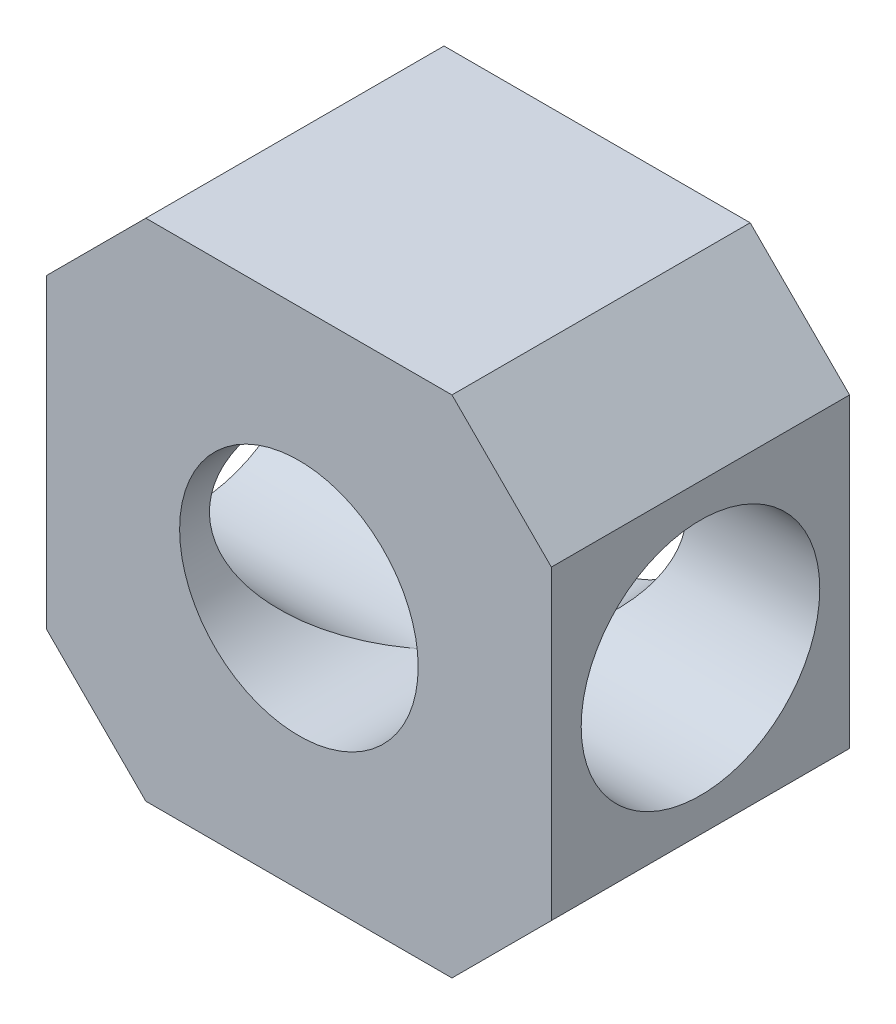
ISO-10303-21;
HEADER;
FILE_DESCRIPTION(('STEP AP214'),'2;1');
FILE_NAME('part.step','',(''),(''),'','','');
FILE_SCHEMA(('AUTOMOTIVE_DESIGN { 1 0 10303 214 1 1 1 1 }'));
ENDSEC;
DATA;
#1=APPLICATION_CONTEXT('core data for automotive mechanical design processes');
#2=APPLICATION_PROTOCOL_DEFINITION('international standard','automotive_design',2000,#1);
#3=PRODUCT_CONTEXT('',#1,'mechanical');
#4=PRODUCT('Part','Part','',(#3));
#5=PRODUCT_RELATED_PRODUCT_CATEGORY('part','',(#4));
#6=PRODUCT_DEFINITION_FORMATION('','',#4);
#7=PRODUCT_DEFINITION_CONTEXT('part definition',#1,'design');
#8=PRODUCT_DEFINITION('design','',#6,#7);
#9=PRODUCT_DEFINITION_SHAPE('','',#8);
#10=(LENGTH_UNIT() NAMED_UNIT(*) SI_UNIT(.MILLI.,.METRE.));
#11=(NAMED_UNIT(*) PLANE_ANGLE_UNIT() SI_UNIT($,.RADIAN.));
#12=(NAMED_UNIT(*) SI_UNIT($,.STERADIAN.) SOLID_ANGLE_UNIT());
#13=UNCERTAINTY_MEASURE_WITH_UNIT(LENGTH_MEASURE(1.E-05),#10,'distance_accuracy_value','');
#14=(GEOMETRIC_REPRESENTATION_CONTEXT(3) GLOBAL_UNCERTAINTY_ASSIGNED_CONTEXT((#13)) GLOBAL_UNIT_ASSIGNED_CONTEXT((#10,
#11,#12)) REPRESENTATION_CONTEXT('',''));
#15=CARTESIAN_POINT('',(0.,0.,0.));
#16=DIRECTION('',(0.,0.,1.));
#17=DIRECTION('',(1.,0.,0.));
#18=AXIS2_PLACEMENT_3D('',#15,#16,#17);
#19=CARTESIAN_POINT('',(-12.7,12.7,0.));
#20=DIRECTION('',(0.,0.,1.));
#21=DIRECTION('',(1.,0.,0.));
#22=AXIS2_PLACEMENT_3D('',#19,#20,#21);
#23=CYLINDRICAL_SURFACE('',#22,6.);
#24=CARTESIAN_POINT('',(-12.7,12.7,15.));
#25=DIRECTION('',(0.,0.,1.));
#26=DIRECTION('',(1.,0.,0.));
#27=AXIS2_PLACEMENT_3D('',#24,#25,#26);
#28=CIRCLE('',#27,6.);
#29=CARTESIAN_POINT('',(-6.69999999999999,12.7,15.));
#30=VERTEX_POINT('',#29);
#31=EDGE_CURVE('E184',#30,#30,#28,.T.);
#32=ORIENTED_EDGE('',*,*,#31,.T.);
#33=EDGE_LOOP('',(#32));
#34=FACE_BOUND('',#33,.T.);
#35=CARTESIAN_POINT('',(-12.7,12.7,7.5));
#36=DIRECTION('',(-0.707106781186547,0.,0.707106781186547));
#37=DIRECTION('',(0.707106781186547,0.,0.707106781186547));
#38=AXIS2_PLACEMENT_3D('',#35,#36,#37);
#39=ELLIPSE('',#38,8.48528137423857,6.);
#40=CARTESIAN_POINT('',(-12.7,18.7,7.5));
#41=VERTEX_POINT('',#40);
#42=CARTESIAN_POINT('',(-12.7,6.7,7.5));
#43=VERTEX_POINT('',#42);
#44=EDGE_CURVE('E55',#41,#43,#39,.F.);
#45=ORIENTED_EDGE('',*,*,#44,.T.);
#46=CARTESIAN_POINT('',(-12.7,12.7,7.5));
#47=DIRECTION('',(0.707106781186547,0.,0.707106781186547));
#48=DIRECTION('',(-0.707106781186547,0.,0.707106781186547));
#49=AXIS2_PLACEMENT_3D('',#46,#47,#48);
#50=ELLIPSE('',#49,8.48528137423857,6.);
#51=EDGE_CURVE('E11',#43,#41,#50,.F.);
#52=ORIENTED_EDGE('',*,*,#51,.T.);
#53=EDGE_LOOP('',(#45,#52));
#54=FACE_BOUND('',#53,.T.);
#55=ADVANCED_FACE('F41',(#34,#54),#23,.F.);
#56=CARTESIAN_POINT('',(0.,25.4,15.));
#57=DIRECTION('',(0.,-1.,0.));
#58=DIRECTION('',(0.,0.,-1.));
#59=AXIS2_PLACEMENT_3D('',#56,#57,#58);
#60=PLANE('',#59);
#61=DIRECTION('',(-1.,0.,0.));
#62=VECTOR('',#61,1.);
#63=CARTESIAN_POINT('',(0.,25.4,0.));
#64=LINE('',#63,#62);
#65=CARTESIAN_POINT('',(-5.,25.4,0.));
#66=VERTEX_POINT('',#65);
#67=CARTESIAN_POINT('',(-20.4,25.4,0.));
#68=VERTEX_POINT('',#67);
#69=EDGE_CURVE('E172',#66,#68,#64,.T.);
#70=ORIENTED_EDGE('',*,*,#69,.T.);
#71=DIRECTION('',(0.,0.,1.));
#72=VECTOR('',#71,1.);
#73=CARTESIAN_POINT('',(-20.4,25.4,15.));
#74=LINE('',#73,#72);
#75=CARTESIAN_POINT('',(-20.4,25.4,15.));
#76=VERTEX_POINT('',#75);
#77=EDGE_CURVE('E122',#68,#76,#74,.T.);
#78=ORIENTED_EDGE('',*,*,#77,.T.);
#79=DIRECTION('',(-1.,0.,0.));
#80=VECTOR('',#79,1.);
#81=CARTESIAN_POINT('',(0.,25.4,15.));
#82=LINE('',#81,#80);
#83=CARTESIAN_POINT('',(-5.,25.4,15.));
#84=VERTEX_POINT('',#83);
#85=EDGE_CURVE('E165',#84,#76,#82,.T.);
#86=ORIENTED_EDGE('',*,*,#85,.F.);
#87=DIRECTION('',(0.,0.,-1.));
#88=VECTOR('',#87,1.);
#89=CARTESIAN_POINT('',(-5.,25.4,15.));
#90=LINE('',#89,#88);
#91=EDGE_CURVE('E128',#84,#66,#90,.T.);
#92=ORIENTED_EDGE('',*,*,#91,.T.);
#93=EDGE_LOOP('',(#70,#78,#86,#92));
#94=FACE_BOUND('',#93,.T.);
#95=ADVANCED_FACE('F207',(#94),#60,.F.);
#96=CARTESIAN_POINT('',(-25.4,0.,15.));
#97=DIRECTION('',(-1.,0.,0.));
#98=DIRECTION('',(0.,0.,1.));
#99=AXIS2_PLACEMENT_3D('',#96,#97,#98);
#100=PLANE('',#99);
#101=CARTESIAN_POINT('',(-25.4,12.7,7.5));
#102=DIRECTION('',(1.,0.,0.));
#103=DIRECTION('',(0.,0.,-1.));
#104=AXIS2_PLACEMENT_3D('',#101,#102,#103);
#105=CIRCLE('',#104,6.);
#106=CARTESIAN_POINT('',(-25.4,12.7,1.5));
#107=VERTEX_POINT('',#106);
#108=EDGE_CURVE('E187',#107,#107,#105,.T.);
#109=ORIENTED_EDGE('',*,*,#108,.T.);
#110=EDGE_LOOP('',(#109));
#111=FACE_BOUND('',#110,.T.);
#112=DIRECTION('',(0.,1.,0.));
#113=VECTOR('',#112,1.);
#114=CARTESIAN_POINT('',(-25.4,0.,0.));
#115=LINE('',#114,#113);
#116=CARTESIAN_POINT('',(-25.4,5.00000000000001,0.));
#117=VERTEX_POINT('',#116);
#118=CARTESIAN_POINT('',(-25.4,20.4,0.));
#119=VERTEX_POINT('',#118);
#120=EDGE_CURVE('E169',#117,#119,#115,.T.);
#121=ORIENTED_EDGE('',*,*,#120,.F.);
#122=DIRECTION('',(0.,0.,1.));
#123=VECTOR('',#122,1.);
#124=CARTESIAN_POINT('',(-25.4,5.00000000000001,15.));
#125=LINE('',#124,#123);
#126=CARTESIAN_POINT('',(-25.4,5.00000000000001,15.));
#127=VERTEX_POINT('',#126);
#128=EDGE_CURVE('E131',#117,#127,#125,.T.);
#129=ORIENTED_EDGE('',*,*,#128,.T.);
#130=DIRECTION('',(0.,1.,0.));
#131=VECTOR('',#130,1.);
#132=CARTESIAN_POINT('',(-25.4,0.,15.));
#133=LINE('',#132,#131);
#134=CARTESIAN_POINT('',(-25.4,20.4,15.));
#135=VERTEX_POINT('',#134);
#136=EDGE_CURVE('E181',#127,#135,#133,.T.);
#137=ORIENTED_EDGE('',*,*,#136,.T.);
#138=DIRECTION('',(0.,0.,-1.));
#139=VECTOR('',#138,1.);
#140=CARTESIAN_POINT('',(-25.4,20.4,0.));
#141=LINE('',#140,#139);
#142=EDGE_CURVE('E133',#135,#119,#141,.T.);
#143=ORIENTED_EDGE('',*,*,#142,.T.);
#144=EDGE_LOOP('',(#121,#129,#137,#143));
#145=FACE_BOUND('',#144,.T.);
#146=ADVANCED_FACE('F196',(#111,#145),#100,.T.);
#147=CARTESIAN_POINT('',(0.,0.,15.));
#148=DIRECTION('',(0.,-1.,0.));
#149=DIRECTION('',(0.,0.,-1.));
#150=AXIS2_PLACEMENT_3D('',#147,#148,#149);
#151=PLANE('',#150);
#152=DIRECTION('',(-1.,0.,0.));
#153=VECTOR('',#152,1.);
#154=CARTESIAN_POINT('',(0.,0.,0.));
#155=LINE('',#154,#153);
#156=CARTESIAN_POINT('',(-5.00000000000001,0.,0.));
#157=VERTEX_POINT('',#156);
#158=CARTESIAN_POINT('',(-20.4,0.,0.));
#159=VERTEX_POINT('',#158);
#160=EDGE_CURVE('E166',#157,#159,#155,.T.);
#161=ORIENTED_EDGE('',*,*,#160,.F.);
#162=DIRECTION('',(0.,0.,1.));
#163=VECTOR('',#162,1.);
#164=CARTESIAN_POINT('',(-5.00000000000001,0.,15.));
#165=LINE('',#164,#163);
#166=CARTESIAN_POINT('',(-5.00000000000001,0.,15.));
#167=VERTEX_POINT('',#166);
#168=EDGE_CURVE('E143',#157,#167,#165,.T.);
#169=ORIENTED_EDGE('',*,*,#168,.T.);
#170=DIRECTION('',(-1.,0.,0.));
#171=VECTOR('',#170,1.);
#172=CARTESIAN_POINT('',(0.,0.,15.));
#173=LINE('',#172,#171);
#174=CARTESIAN_POINT('',(-20.4,0.,15.));
#175=VERTEX_POINT('',#174);
#176=EDGE_CURVE('E178',#167,#175,#173,.T.);
#177=ORIENTED_EDGE('',*,*,#176,.T.);
#178=DIRECTION('',(0.,0.,-1.));
#179=VECTOR('',#178,1.);
#180=CARTESIAN_POINT('',(-20.4,0.,15.));
#181=LINE('',#180,#179);
#182=EDGE_CURVE('E145',#175,#159,#181,.T.);
#183=ORIENTED_EDGE('',*,*,#182,.T.);
#184=EDGE_LOOP('',(#161,#169,#177,#183));
#185=FACE_BOUND('',#184,.T.);
#186=ADVANCED_FACE('F250',(#185),#151,.T.);
#187=CARTESIAN_POINT('',(0.,0.,15.));
#188=DIRECTION('',(-1.,0.,0.));
#189=DIRECTION('',(0.,0.,1.));
#190=AXIS2_PLACEMENT_3D('',#187,#188,#189);
#191=PLANE('',#190);
#192=CARTESIAN_POINT('',(0.,12.7,7.5));
#193=DIRECTION('',(1.,0.,0.));
#194=DIRECTION('',(0.,0.,-1.));
#195=AXIS2_PLACEMENT_3D('',#192,#193,#194);
#196=CIRCLE('',#195,6.);
#197=CARTESIAN_POINT('',(0.,12.7,1.5));
#198=VERTEX_POINT('',#197);
#199=EDGE_CURVE('E190',#198,#198,#196,.T.);
#200=ORIENTED_EDGE('',*,*,#199,.F.);
#201=EDGE_LOOP('',(#200));
#202=FACE_BOUND('',#201,.T.);
#203=DIRECTION('',(0.,1.,0.));
#204=VECTOR('',#203,1.);
#205=CARTESIAN_POINT('',(0.,0.,15.));
#206=LINE('',#205,#204);
#207=CARTESIAN_POINT('',(0.,5.,15.));
#208=VERTEX_POINT('',#207);
#209=CARTESIAN_POINT('',(0.,20.4,15.));
#210=VERTEX_POINT('',#209);
#211=EDGE_CURVE('E161',#208,#210,#206,.T.);
#212=ORIENTED_EDGE('',*,*,#211,.F.);
#213=DIRECTION('',(0.,0.,-1.));
#214=VECTOR('',#213,1.);
#215=CARTESIAN_POINT('',(0.,5.,0.));
#216=LINE('',#215,#214);
#217=CARTESIAN_POINT('',(0.,5.,0.));
#218=VERTEX_POINT('',#217);
#219=EDGE_CURVE('E156',#208,#218,#216,.T.);
#220=ORIENTED_EDGE('',*,*,#219,.T.);
#221=DIRECTION('',(0.,1.,0.));
#222=VECTOR('',#221,1.);
#223=CARTESIAN_POINT('',(0.,0.,0.));
#224=LINE('',#223,#222);
#225=CARTESIAN_POINT('',(0.,20.4,0.));
#226=VERTEX_POINT('',#225);
#227=EDGE_CURVE('E162',#218,#226,#224,.T.);
#228=ORIENTED_EDGE('',*,*,#227,.T.);
#229=DIRECTION('',(0.,0.,1.));
#230=VECTOR('',#229,1.);
#231=CARTESIAN_POINT('',(0.,20.4,15.));
#232=LINE('',#231,#230);
#233=EDGE_CURVE('E159',#226,#210,#232,.T.);
#234=ORIENTED_EDGE('',*,*,#233,.T.);
#235=EDGE_LOOP('',(#212,#220,#228,#234));
#236=FACE_BOUND('',#235,.T.);
#237=ADVANCED_FACE('F257',(#202,#236),#191,.F.);
#238=CARTESIAN_POINT('',(0.,0.,15.));
#239=DIRECTION('',(0.,0.,-1.));
#240=DIRECTION('',(-1.,0.,0.));
#241=AXIS2_PLACEMENT_3D('',#238,#239,#240);
#242=PLANE('',#241);
#243=ORIENTED_EDGE('',*,*,#31,.F.);
#244=EDGE_LOOP('',(#243));
#245=FACE_BOUND('',#244,.T.);
#246=ORIENTED_EDGE('',*,*,#176,.F.);
#247=DIRECTION('',(0.707106781186549,0.707106781186547,0.));
#248=VECTOR('',#247,1.);
#249=CARTESIAN_POINT('',(0.,5.,15.));
#250=LINE('',#249,#248);
#251=EDGE_CURVE('E136',#167,#208,#250,.T.);
#252=ORIENTED_EDGE('',*,*,#251,.T.);
#253=ORIENTED_EDGE('',*,*,#211,.T.);
#254=DIRECTION('',(0.707106781186547,-0.707106781186549,0.));
#255=VECTOR('',#254,1.);
#256=CARTESIAN_POINT('',(-5.,25.4,15.));
#257=LINE('',#256,#255);
#258=EDGE_CURVE('E141',#210,#84,#257,.F.);
#259=ORIENTED_EDGE('',*,*,#258,.T.);
#260=ORIENTED_EDGE('',*,*,#85,.T.);
#261=DIRECTION('',(-0.707106781186549,-0.707106781186547,0.));
#262=VECTOR('',#261,1.);
#263=CARTESIAN_POINT('',(-25.4,20.4,15.));
#264=LINE('',#263,#262);
#265=EDGE_CURVE('E63',#76,#135,#264,.T.);
#266=ORIENTED_EDGE('',*,*,#265,.T.);
#267=ORIENTED_EDGE('',*,*,#136,.F.);
#268=DIRECTION('',(-0.707106781186547,0.707106781186549,0.));
#269=VECTOR('',#268,1.);
#270=CARTESIAN_POINT('',(-20.4,0.,15.));
#271=LINE('',#270,#269);
#272=EDGE_CURVE('E138',#127,#175,#271,.F.);
#273=ORIENTED_EDGE('',*,*,#272,.T.);
#274=EDGE_LOOP('',(#246,#252,#253,#259,#260,#266,#267,#273));
#275=FACE_BOUND('',#274,.T.);
#276=ADVANCED_FACE('F235',(#245,#275),#242,.F.);
#277=CARTESIAN_POINT('',(0.,0.,0.));
#278=DIRECTION('',(0.,0.,-1.));
#279=DIRECTION('',(-1.,0.,0.));
#280=AXIS2_PLACEMENT_3D('',#277,#278,#279);
#281=PLANE('',#280);
#282=CARTESIAN_POINT('',(-12.7,12.7,0.));
#283=DIRECTION('',(0.,0.,1.));
#284=DIRECTION('',(1.,0.,0.));
#285=AXIS2_PLACEMENT_3D('',#282,#283,#284);
#286=CIRCLE('',#285,6.);
#287=CARTESIAN_POINT('',(-6.69999999999999,12.7,0.));
#288=VERTEX_POINT('',#287);
#289=EDGE_CURVE('E175',#288,#288,#286,.T.);
#290=ORIENTED_EDGE('',*,*,#289,.T.);
#291=EDGE_LOOP('',(#290));
#292=FACE_BOUND('',#291,.T.);
#293=ORIENTED_EDGE('',*,*,#227,.F.);
#294=DIRECTION('',(-0.707106781186549,-0.707106781186547,0.));
#295=VECTOR('',#294,1.);
#296=CARTESIAN_POINT('',(-2.5,2.50000000000001,0.));
#297=LINE('',#296,#295);
#298=EDGE_CURVE('E148',#218,#157,#297,.T.);
#299=ORIENTED_EDGE('',*,*,#298,.T.);
#300=ORIENTED_EDGE('',*,*,#160,.T.);
#301=DIRECTION('',(0.707106781186547,-0.707106781186549,0.));
#302=VECTOR('',#301,1.);
#303=CARTESIAN_POINT('',(-10.2,-10.2,0.));
#304=LINE('',#303,#302);
#305=EDGE_CURVE('E150',#159,#117,#304,.F.);
#306=ORIENTED_EDGE('',*,*,#305,.T.);
#307=ORIENTED_EDGE('',*,*,#120,.T.);
#308=DIRECTION('',(0.707106781186549,0.707106781186547,0.));
#309=VECTOR('',#308,1.);
#310=CARTESIAN_POINT('',(-22.9,22.9,0.));
#311=LINE('',#310,#309);
#312=EDGE_CURVE('E152',#119,#68,#311,.T.);
#313=ORIENTED_EDGE('',*,*,#312,.T.);
#314=ORIENTED_EDGE('',*,*,#69,.F.);
#315=DIRECTION('',(-0.707106781186547,0.707106781186549,0.));
#316=VECTOR('',#315,1.);
#317=CARTESIAN_POINT('',(10.2,10.2,0.));
#318=LINE('',#317,#316);
#319=EDGE_CURVE('E154',#66,#226,#318,.F.);
#320=ORIENTED_EDGE('',*,*,#319,.T.);
#321=EDGE_LOOP('',(#293,#299,#300,#306,#307,#313,#314,#320));
#322=FACE_BOUND('',#321,.T.);
#323=ADVANCED_FACE('F244',(#292,#322),#281,.T.);
#324=CARTESIAN_POINT('',(0.,5.,15.));
#325=DIRECTION('',(0.707106781186546,-0.707106781186548,0.));
#326=DIRECTION('',(0.,0.,1.));
#327=AXIS2_PLACEMENT_3D('',#324,#325,#326);
#328=PLANE('',#327);
#329=ORIENTED_EDGE('',*,*,#251,.F.);
#330=ORIENTED_EDGE('',*,*,#168,.F.);
#331=ORIENTED_EDGE('',*,*,#298,.F.);
#332=ORIENTED_EDGE('',*,*,#219,.F.);
#333=EDGE_LOOP('',(#329,#330,#331,#332));
#334=FACE_BOUND('',#333,.T.);
#335=ADVANCED_FACE('F255',(#334),#328,.T.);
#336=CARTESIAN_POINT('',(-20.4,0.,15.));
#337=DIRECTION('',(0.707106781186548,0.707106781186546,0.));
#338=DIRECTION('',(0.,0.,-1.));
#339=AXIS2_PLACEMENT_3D('',#336,#337,#338);
#340=PLANE('',#339);
#341=ORIENTED_EDGE('',*,*,#272,.F.);
#342=ORIENTED_EDGE('',*,*,#128,.F.);
#343=ORIENTED_EDGE('',*,*,#305,.F.);
#344=ORIENTED_EDGE('',*,*,#182,.F.);
#345=EDGE_LOOP('',(#341,#342,#343,#344));
#346=FACE_BOUND('',#345,.T.);
#347=ADVANCED_FACE('F228',(#346),#340,.F.);
#348=CARTESIAN_POINT('',(-25.4,20.4,15.));
#349=DIRECTION('',(-0.707106781186547,0.707106781186549,0.));
#350=DIRECTION('',(0.,0.,1.));
#351=AXIS2_PLACEMENT_3D('',#348,#349,#350);
#352=PLANE('',#351);
#353=ORIENTED_EDGE('',*,*,#265,.F.);
#354=ORIENTED_EDGE('',*,*,#77,.F.);
#355=ORIENTED_EDGE('',*,*,#312,.F.);
#356=ORIENTED_EDGE('',*,*,#142,.F.);
#357=EDGE_LOOP('',(#353,#354,#355,#356));
#358=FACE_BOUND('',#357,.T.);
#359=ADVANCED_FACE('F222',(#358),#352,.T.);
#360=CARTESIAN_POINT('',(-5.,25.4,15.));
#361=DIRECTION('',(-0.707106781186549,-0.707106781186547,0.));
#362=DIRECTION('',(0.,0.,-1.));
#363=AXIS2_PLACEMENT_3D('',#360,#361,#362);
#364=PLANE('',#363);
#365=ORIENTED_EDGE('',*,*,#258,.F.);
#366=ORIENTED_EDGE('',*,*,#233,.F.);
#367=ORIENTED_EDGE('',*,*,#319,.F.);
#368=ORIENTED_EDGE('',*,*,#91,.F.);
#369=EDGE_LOOP('',(#365,#366,#367,#368));
#370=FACE_BOUND('',#369,.T.);
#371=ADVANCED_FACE('F44',(#370),#364,.F.);
#372=CARTESIAN_POINT('',(-12.7,12.7,7.5));
#373=DIRECTION('',(-0.707106781186547,0.,0.707106781186547));
#374=DIRECTION('',(0.707106781186547,0.,0.707106781186547));
#375=AXIS2_PLACEMENT_3D('',#372,#373,#374);
#376=ELLIPSE('',#375,8.48528137423857,6.);
#377=EDGE_CURVE('E115',#41,#43,#376,.T.);
#378=ORIENTED_EDGE('',*,*,#377,.T.);
#379=CARTESIAN_POINT('',(-12.7,12.7,7.5));
#380=DIRECTION('',(0.707106781186547,0.,0.707106781186547));
#381=DIRECTION('',(-0.707106781186547,0.,0.707106781186547));
#382=AXIS2_PLACEMENT_3D('',#379,#380,#381);
#383=ELLIPSE('',#382,8.48528137423857,6.);
#384=EDGE_CURVE('E50',#43,#41,#383,.T.);
#385=ORIENTED_EDGE('',*,*,#384,.T.);
#386=EDGE_LOOP('',(#378,#385));
#387=FACE_BOUND('',#386,.T.);
#388=ORIENTED_EDGE('',*,*,#289,.F.);
#389=EDGE_LOOP('',(#388));
#390=FACE_BOUND('',#389,.T.);
#391=ADVANCED_FACE('F124',(#387,#390),#23,.F.);
#392=CARTESIAN_POINT('',(-25.4,12.7,7.5));
#393=DIRECTION('',(1.,0.,0.));
#394=DIRECTION('',(0.,0.,-1.));
#395=AXIS2_PLACEMENT_3D('',#392,#393,#394);
#396=CYLINDRICAL_SURFACE('',#395,6.);
#397=ORIENTED_EDGE('',*,*,#199,.T.);
#398=EDGE_LOOP('',(#397));
#399=FACE_BOUND('',#398,.T.);
#400=ORIENTED_EDGE('',*,*,#44,.F.);
#401=ORIENTED_EDGE('',*,*,#384,.F.);
#402=EDGE_LOOP('',(#400,#401));
#403=FACE_BOUND('',#402,.T.);
#404=ADVANCED_FACE('F121',(#399,#403),#396,.F.);
#405=ORIENTED_EDGE('',*,*,#108,.F.);
#406=EDGE_LOOP('',(#405));
#407=FACE_BOUND('',#406,.T.);
#408=ORIENTED_EDGE('',*,*,#377,.F.);
#409=ORIENTED_EDGE('',*,*,#51,.F.);
#410=EDGE_LOOP('',(#408,#409));
#411=FACE_BOUND('',#410,.T.);
#412=ADVANCED_FACE('F116',(#407,#411),#396,.F.);
#413=CLOSED_SHELL('',(#55,#95,#146,#186,#237,#276,#323,#335,#347,#359,#371,#391,#404,#412));
#414=MANIFOLD_SOLID_BREP('B2',#413);
#415=ADVANCED_BREP_SHAPE_REPRESENTATION('',(#18,#414),#14);
#416=SHAPE_DEFINITION_REPRESENTATION(#9,#415);
ENDSEC;
END-ISO-10303-21;
